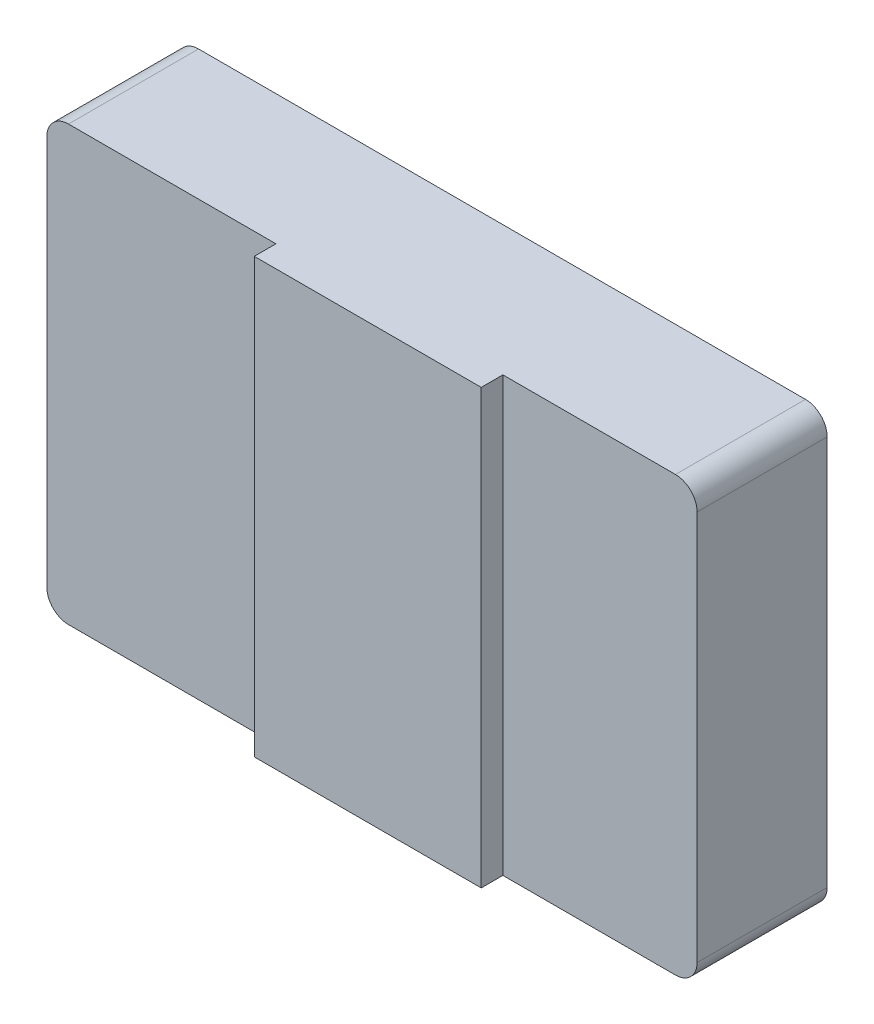
ISO-10303-21;
HEADER;
FILE_DESCRIPTION(('STEP AP214'),'2;1');
FILE_NAME('part.step','',(''),(''),'','','');
FILE_SCHEMA(('AUTOMOTIVE_DESIGN { 1 0 10303 214 1 1 1 1 }'));
ENDSEC;
DATA;
#1=APPLICATION_CONTEXT('core data for automotive mechanical design processes');
#2=APPLICATION_PROTOCOL_DEFINITION('international standard','automotive_design',2000,#1);
#3=PRODUCT_CONTEXT('',#1,'mechanical');
#4=PRODUCT('Part','Part','',(#3));
#5=PRODUCT_RELATED_PRODUCT_CATEGORY('part','',(#4));
#6=PRODUCT_DEFINITION_FORMATION('','',#4);
#7=PRODUCT_DEFINITION_CONTEXT('part definition',#1,'design');
#8=PRODUCT_DEFINITION('design','',#6,#7);
#9=PRODUCT_DEFINITION_SHAPE('','',#8);
#10=(LENGTH_UNIT() NAMED_UNIT(*) SI_UNIT(.MILLI.,.METRE.));
#11=(NAMED_UNIT(*) PLANE_ANGLE_UNIT() SI_UNIT($,.RADIAN.));
#12=(NAMED_UNIT(*) SI_UNIT($,.STERADIAN.) SOLID_ANGLE_UNIT());
#13=UNCERTAINTY_MEASURE_WITH_UNIT(LENGTH_MEASURE(1.E-05),#10,'distance_accuracy_value','');
#14=(GEOMETRIC_REPRESENTATION_CONTEXT(3) GLOBAL_UNCERTAINTY_ASSIGNED_CONTEXT((#13)) GLOBAL_UNIT_ASSIGNED_CONTEXT((#10,
#11,#12)) REPRESENTATION_CONTEXT('',''));
#15=CARTESIAN_POINT('',(0.,0.,0.));
#16=DIRECTION('',(0.,0.,1.));
#17=DIRECTION('',(1.,0.,0.));
#18=AXIS2_PLACEMENT_3D('',#15,#16,#17);
#19=CARTESIAN_POINT('',(0.,0.,0.7));
#20=DIRECTION('',(1.,0.,0.));
#21=DIRECTION('',(0.,0.,-1.));
#22=AXIS2_PLACEMENT_3D('',#19,#20,#21);
#23=PLANE('',#22);
#24=DIRECTION('',(0.,-1.,0.));
#25=VECTOR('',#24,1.);
#26=CARTESIAN_POINT('',(0.,0.,0.));
#27=LINE('',#26,#25);
#28=CARTESIAN_POINT('',(0.,1.9,0.));
#29=VERTEX_POINT('',#28);
#30=CARTESIAN_POINT('',(0.,0.1,0.));
#31=VERTEX_POINT('',#30);
#32=EDGE_CURVE('E169',#29,#31,#27,.T.);
#33=ORIENTED_EDGE('',*,*,#32,.T.);
#34=DIRECTION('',(0.,0.,-1.));
#35=VECTOR('',#34,1.);
#36=CARTESIAN_POINT('',(0.,0.1,0.7));
#37=LINE('',#36,#35);
#38=CARTESIAN_POINT('',(0.,0.1,0.6));
#39=VERTEX_POINT('',#38);
#40=EDGE_CURVE('E50',#31,#39,#37,.F.);
#41=ORIENTED_EDGE('',*,*,#40,.T.);
#42=DIRECTION('',(0.,-1.,0.));
#43=VECTOR('',#42,1.);
#44=CARTESIAN_POINT('',(0.,0.,0.6));
#45=LINE('',#44,#43);
#46=CARTESIAN_POINT('',(0.,1.9,0.6));
#47=VERTEX_POINT('',#46);
#48=EDGE_CURVE('E134',#47,#39,#45,.T.);
#49=ORIENTED_EDGE('',*,*,#48,.F.);
#50=DIRECTION('',(0.,0.,-1.));
#51=VECTOR('',#50,1.);
#52=CARTESIAN_POINT('',(0.,1.9,0.7));
#53=LINE('',#52,#51);
#54=EDGE_CURVE('E206',#47,#29,#53,.T.);
#55=ORIENTED_EDGE('',*,*,#54,.T.);
#56=EDGE_LOOP('',(#33,#41,#49,#55));
#57=FACE_BOUND('',#56,.T.);
#58=ADVANCED_FACE('F35',(#57),#23,.F.);
#59=CARTESIAN_POINT('',(0.,0.,0.7));
#60=DIRECTION('',(0.,1.,0.));
#61=DIRECTION('',(0.,0.,1.));
#62=AXIS2_PLACEMENT_3D('',#59,#60,#61);
#63=PLANE('',#62);
#64=DIRECTION('',(1.,0.,0.));
#65=VECTOR('',#64,1.);
#66=CARTESIAN_POINT('',(0.,0.,0.));
#67=LINE('',#66,#65);
#68=CARTESIAN_POINT('',(0.1,0.,0.));
#69=VERTEX_POINT('',#68);
#70=CARTESIAN_POINT('',(2.9,0.,0.));
#71=VERTEX_POINT('',#70);
#72=EDGE_CURVE('E171',#69,#71,#67,.T.);
#73=ORIENTED_EDGE('',*,*,#72,.T.);
#74=DIRECTION('',(0.,0.,-1.));
#75=VECTOR('',#74,1.);
#76=CARTESIAN_POINT('',(2.9,0.,0.7));
#77=LINE('',#76,#75);
#78=CARTESIAN_POINT('',(2.9,0.,0.6));
#79=VERTEX_POINT('',#78);
#80=EDGE_CURVE('E204',#71,#79,#77,.F.);
#81=ORIENTED_EDGE('',*,*,#80,.T.);
#82=DIRECTION('',(1.,0.,0.));
#83=VECTOR('',#82,1.);
#84=CARTESIAN_POINT('',(0.,0.,0.6));
#85=LINE('',#84,#83);
#86=CARTESIAN_POINT('',(2.10400262426842,0.,0.6));
#87=VERTEX_POINT('',#86);
#88=EDGE_CURVE('E136',#87,#79,#85,.T.);
#89=ORIENTED_EDGE('',*,*,#88,.F.);
#90=DIRECTION('',(0.,0.,1.));
#91=VECTOR('',#90,1.);
#92=CARTESIAN_POINT('',(2.10400262426842,0.,0.6));
#93=LINE('',#92,#91);
#94=CARTESIAN_POINT('',(2.10400262426842,0.,0.7));
#95=VERTEX_POINT('',#94);
#96=EDGE_CURVE('E152',#87,#95,#93,.T.);
#97=ORIENTED_EDGE('',*,*,#96,.T.);
#98=DIRECTION('',(1.,0.,0.));
#99=VECTOR('',#98,1.);
#100=CARTESIAN_POINT('',(0.,0.,0.7));
#101=LINE('',#100,#99);
#102=CARTESIAN_POINT('',(1.0569541190119,0.,0.7));
#103=VERTEX_POINT('',#102);
#104=EDGE_CURVE('E151',#103,#95,#101,.T.);
#105=ORIENTED_EDGE('',*,*,#104,.F.);
#106=DIRECTION('',(0.,0.,1.));
#107=VECTOR('',#106,1.);
#108=CARTESIAN_POINT('',(1.0569541190119,0.,0.6));
#109=LINE('',#108,#107);
#110=CARTESIAN_POINT('',(1.0569541190119,0.,0.6));
#111=VERTEX_POINT('',#110);
#112=EDGE_CURVE('E139',#111,#103,#109,.T.);
#113=ORIENTED_EDGE('',*,*,#112,.F.);
#114=CARTESIAN_POINT('',(0.1,0.,0.6));
#115=VERTEX_POINT('',#114);
#116=EDGE_CURVE('E123',#115,#111,#85,.T.);
#117=ORIENTED_EDGE('',*,*,#116,.F.);
#118=DIRECTION('',(0.,0.,-1.));
#119=VECTOR('',#118,1.);
#120=CARTESIAN_POINT('',(0.1,0.,0.7));
#121=LINE('',#120,#119);
#122=EDGE_CURVE('E202',#115,#69,#121,.T.);
#123=ORIENTED_EDGE('',*,*,#122,.T.);
#124=EDGE_LOOP('',(#73,#81,#89,#97,#105,#113,#117,#123));
#125=FACE_BOUND('',#124,.T.);
#126=ADVANCED_FACE('F148',(#125),#63,.F.);
#127=CARTESIAN_POINT('',(3.,0.,0.7));
#128=DIRECTION('',(-1.,0.,0.));
#129=DIRECTION('',(0.,0.,1.));
#130=AXIS2_PLACEMENT_3D('',#127,#128,#129);
#131=PLANE('',#130);
#132=DIRECTION('',(0.,1.,0.));
#133=VECTOR('',#132,1.);
#134=CARTESIAN_POINT('',(3.,0.,0.));
#135=LINE('',#134,#133);
#136=CARTESIAN_POINT('',(3.,0.1,0.));
#137=VERTEX_POINT('',#136);
#138=CARTESIAN_POINT('',(3.,1.9,0.));
#139=VERTEX_POINT('',#138);
#140=EDGE_CURVE('E173',#137,#139,#135,.T.);
#141=ORIENTED_EDGE('',*,*,#140,.T.);
#142=DIRECTION('',(0.,0.,-1.));
#143=VECTOR('',#142,1.);
#144=CARTESIAN_POINT('',(3.,1.9,0.7));
#145=LINE('',#144,#143);
#146=CARTESIAN_POINT('',(3.,1.9,0.6));
#147=VERTEX_POINT('',#146);
#148=EDGE_CURVE('E196',#139,#147,#145,.F.);
#149=ORIENTED_EDGE('',*,*,#148,.T.);
#150=DIRECTION('',(0.,1.,0.));
#151=VECTOR('',#150,1.);
#152=CARTESIAN_POINT('',(3.,0.,0.6));
#153=LINE('',#152,#151);
#154=CARTESIAN_POINT('',(3.,0.1,0.6));
#155=VERTEX_POINT('',#154);
#156=EDGE_CURVE('E133',#155,#147,#153,.T.);
#157=ORIENTED_EDGE('',*,*,#156,.F.);
#158=DIRECTION('',(0.,0.,-1.));
#159=VECTOR('',#158,1.);
#160=CARTESIAN_POINT('',(3.,0.1,0.7));
#161=LINE('',#160,#159);
#162=EDGE_CURVE('E193',#155,#137,#161,.T.);
#163=ORIENTED_EDGE('',*,*,#162,.T.);
#164=EDGE_LOOP('',(#141,#149,#157,#163));
#165=FACE_BOUND('',#164,.T.);
#166=ADVANCED_FACE('F230',(#165),#131,.F.);
#167=CARTESIAN_POINT('',(0.,2.,0.7));
#168=DIRECTION('',(0.,-1.,0.));
#169=DIRECTION('',(0.,0.,-1.));
#170=AXIS2_PLACEMENT_3D('',#167,#168,#169);
#171=PLANE('',#170);
#172=DIRECTION('',(-1.,0.,0.));
#173=VECTOR('',#172,1.);
#174=CARTESIAN_POINT('',(0.,2.,0.6));
#175=LINE('',#174,#173);
#176=CARTESIAN_POINT('',(2.9,2.,0.6));
#177=VERTEX_POINT('',#176);
#178=CARTESIAN_POINT('',(2.10400262426842,2.,0.6));
#179=VERTEX_POINT('',#178);
#180=EDGE_CURVE('E178',#177,#179,#175,.T.);
#181=ORIENTED_EDGE('',*,*,#180,.F.);
#182=DIRECTION('',(0.,0.,-1.));
#183=VECTOR('',#182,1.);
#184=CARTESIAN_POINT('',(2.9,2.,0.7));
#185=LINE('',#184,#183);
#186=CARTESIAN_POINT('',(2.9,2.,0.));
#187=VERTEX_POINT('',#186);
#188=EDGE_CURVE('E182',#177,#187,#185,.T.);
#189=ORIENTED_EDGE('',*,*,#188,.T.);
#190=DIRECTION('',(-1.,0.,0.));
#191=VECTOR('',#190,1.);
#192=CARTESIAN_POINT('',(0.,2.,0.));
#193=LINE('',#192,#191);
#194=CARTESIAN_POINT('',(0.1,2.,0.));
#195=VERTEX_POINT('',#194);
#196=EDGE_CURVE('E165',#187,#195,#193,.T.);
#197=ORIENTED_EDGE('',*,*,#196,.T.);
#198=DIRECTION('',(0.,0.,-1.));
#199=VECTOR('',#198,1.);
#200=CARTESIAN_POINT('',(0.1,2.,0.7));
#201=LINE('',#200,#199);
#202=CARTESIAN_POINT('',(0.1,2.,0.6));
#203=VERTEX_POINT('',#202);
#204=EDGE_CURVE('E180',#195,#203,#201,.F.);
#205=ORIENTED_EDGE('',*,*,#204,.T.);
#206=CARTESIAN_POINT('',(1.0569541190119,2.,0.6));
#207=VERTEX_POINT('',#206);
#208=EDGE_CURVE('E168',#207,#203,#175,.T.);
#209=ORIENTED_EDGE('',*,*,#208,.F.);
#210=DIRECTION('',(0.,0.,1.));
#211=VECTOR('',#210,1.);
#212=CARTESIAN_POINT('',(1.0569541190119,2.,0.6));
#213=LINE('',#212,#211);
#214=CARTESIAN_POINT('',(1.0569541190119,2.,0.7));
#215=VERTEX_POINT('',#214);
#216=EDGE_CURVE('E142',#207,#215,#213,.T.);
#217=ORIENTED_EDGE('',*,*,#216,.T.);
#218=DIRECTION('',(-1.,0.,0.));
#219=VECTOR('',#218,1.);
#220=CARTESIAN_POINT('',(0.,2.,0.7));
#221=LINE('',#220,#219);
#222=CARTESIAN_POINT('',(2.10400262426842,2.,0.7));
#223=VERTEX_POINT('',#222);
#224=EDGE_CURVE('E164',#223,#215,#221,.T.);
#225=ORIENTED_EDGE('',*,*,#224,.F.);
#226=DIRECTION('',(0.,0.,1.));
#227=VECTOR('',#226,1.);
#228=CARTESIAN_POINT('',(2.10400262426842,2.,0.6));
#229=LINE('',#228,#227);
#230=EDGE_CURVE('E154',#179,#223,#229,.T.);
#231=ORIENTED_EDGE('',*,*,#230,.F.);
#232=EDGE_LOOP('',(#181,#189,#197,#205,#209,#217,#225,#231));
#233=FACE_BOUND('',#232,.T.);
#234=ADVANCED_FACE('F239',(#233),#171,.F.);
#235=CARTESIAN_POINT('',(0.,0.,0.7));
#236=DIRECTION('',(0.,0.,-1.));
#237=DIRECTION('',(-1.,0.,0.));
#238=AXIS2_PLACEMENT_3D('',#235,#236,#237);
#239=PLANE('',#238);
#240=DIRECTION('',(0.,-1.,0.));
#241=VECTOR('',#240,1.);
#242=CARTESIAN_POINT('',(1.0569541190119,2.,0.7));
#243=LINE('',#242,#241);
#244=EDGE_CURVE('E246',#215,#103,#243,.T.);
#245=ORIENTED_EDGE('',*,*,#244,.T.);
#246=ORIENTED_EDGE('',*,*,#104,.T.);
#247=DIRECTION('',(0.,1.,0.));
#248=VECTOR('',#247,1.);
#249=CARTESIAN_POINT('',(2.10400262426842,2.,0.7));
#250=LINE('',#249,#248);
#251=EDGE_CURVE('E144',#95,#223,#250,.T.);
#252=ORIENTED_EDGE('',*,*,#251,.T.);
#253=ORIENTED_EDGE('',*,*,#224,.T.);
#254=EDGE_LOOP('',(#245,#246,#252,#253));
#255=FACE_BOUND('',#254,.T.);
#256=ADVANCED_FACE('F248',(#255),#239,.F.);
#257=CARTESIAN_POINT('',(0.,0.,0.));
#258=DIRECTION('',(0.,0.,-1.));
#259=DIRECTION('',(-1.,0.,0.));
#260=AXIS2_PLACEMENT_3D('',#257,#258,#259);
#261=PLANE('',#260);
#262=ORIENTED_EDGE('',*,*,#196,.F.);
#263=CARTESIAN_POINT('',(2.9,1.9,0.));
#264=DIRECTION('',(0.,0.,-1.));
#265=DIRECTION('',(-1.,0.,0.));
#266=AXIS2_PLACEMENT_3D('',#263,#264,#265);
#267=CIRCLE('',#266,0.1);
#268=EDGE_CURVE('E191',#187,#139,#267,.T.);
#269=ORIENTED_EDGE('',*,*,#268,.T.);
#270=ORIENTED_EDGE('',*,*,#140,.F.);
#271=CARTESIAN_POINT('',(2.9,0.1,0.));
#272=DIRECTION('',(0.,0.,-1.));
#273=DIRECTION('',(-1.,0.,0.));
#274=AXIS2_PLACEMENT_3D('',#271,#272,#273);
#275=CIRCLE('',#274,0.1);
#276=EDGE_CURVE('E189',#137,#71,#275,.T.);
#277=ORIENTED_EDGE('',*,*,#276,.T.);
#278=ORIENTED_EDGE('',*,*,#72,.F.);
#279=CARTESIAN_POINT('',(0.1,0.1,0.));
#280=DIRECTION('',(0.,0.,-1.));
#281=DIRECTION('',(-1.,0.,0.));
#282=AXIS2_PLACEMENT_3D('',#279,#280,#281);
#283=CIRCLE('',#282,0.1);
#284=EDGE_CURVE('E187',#69,#31,#283,.T.);
#285=ORIENTED_EDGE('',*,*,#284,.T.);
#286=ORIENTED_EDGE('',*,*,#32,.F.);
#287=CARTESIAN_POINT('',(0.1,1.9,0.));
#288=DIRECTION('',(0.,0.,-1.));
#289=DIRECTION('',(-1.,0.,0.));
#290=AXIS2_PLACEMENT_3D('',#287,#288,#289);
#291=CIRCLE('',#290,0.1);
#292=EDGE_CURVE('E185',#29,#195,#291,.T.);
#293=ORIENTED_EDGE('',*,*,#292,.T.);
#294=EDGE_LOOP('',(#262,#269,#270,#277,#278,#285,#286,#293));
#295=FACE_BOUND('',#294,.T.);
#296=ADVANCED_FACE('F214',(#295),#261,.T.);
#297=CARTESIAN_POINT('',(2.10400262426842,2.,0.6));
#298=DIRECTION('',(1.,0.,0.));
#299=DIRECTION('',(0.,0.,-1.));
#300=AXIS2_PLACEMENT_3D('',#297,#298,#299);
#301=PLANE('',#300);
#302=ORIENTED_EDGE('',*,*,#251,.F.);
#303=ORIENTED_EDGE('',*,*,#96,.F.);
#304=DIRECTION('',(0.,1.,0.));
#305=VECTOR('',#304,1.);
#306=CARTESIAN_POINT('',(2.10400262426842,2.,0.6));
#307=LINE('',#306,#305);
#308=EDGE_CURVE('E143',#87,#179,#307,.T.);
#309=ORIENTED_EDGE('',*,*,#308,.T.);
#310=ORIENTED_EDGE('',*,*,#230,.T.);
#311=EDGE_LOOP('',(#302,#303,#309,#310));
#312=FACE_BOUND('',#311,.T.);
#313=ADVANCED_FACE('F308',(#312),#301,.T.);
#314=CARTESIAN_POINT('',(1.5,1.,0.6));
#315=DIRECTION('',(0.,0.,1.));
#316=DIRECTION('',(1.,0.,0.));
#317=AXIS2_PLACEMENT_3D('',#314,#315,#316);
#318=PLANE('',#317);
#319=ORIENTED_EDGE('',*,*,#156,.T.);
#320=CARTESIAN_POINT('',(2.9,1.9,0.6));
#321=DIRECTION('',(0.,0.,1.));
#322=DIRECTION('',(1.,0.,0.));
#323=AXIS2_PLACEMENT_3D('',#320,#321,#322);
#324=CIRCLE('',#323,0.1);
#325=EDGE_CURVE('E200',#147,#177,#324,.T.);
#326=ORIENTED_EDGE('',*,*,#325,.T.);
#327=ORIENTED_EDGE('',*,*,#180,.T.);
#328=ORIENTED_EDGE('',*,*,#308,.F.);
#329=ORIENTED_EDGE('',*,*,#88,.T.);
#330=CARTESIAN_POINT('',(2.9,0.1,0.6));
#331=DIRECTION('',(0.,0.,1.));
#332=DIRECTION('',(1.,0.,0.));
#333=AXIS2_PLACEMENT_3D('',#330,#331,#332);
#334=CIRCLE('',#333,0.1);
#335=EDGE_CURVE('E198',#79,#155,#334,.T.);
#336=ORIENTED_EDGE('',*,*,#335,.T.);
#337=EDGE_LOOP('',(#319,#326,#327,#328,#329,#336));
#338=FACE_BOUND('',#337,.T.);
#339=ADVANCED_FACE('F227',(#338),#318,.T.);
#340=ORIENTED_EDGE('',*,*,#48,.T.);
#341=CARTESIAN_POINT('',(0.1,0.1,0.6));
#342=DIRECTION('',(0.,0.,1.));
#343=DIRECTION('',(1.,0.,0.));
#344=AXIS2_PLACEMENT_3D('',#341,#342,#343);
#345=CIRCLE('',#344,0.1);
#346=EDGE_CURVE('E12',#39,#115,#345,.T.);
#347=ORIENTED_EDGE('',*,*,#346,.T.);
#348=ORIENTED_EDGE('',*,*,#116,.T.);
#349=DIRECTION('',(0.,-1.,0.));
#350=VECTOR('',#349,1.);
#351=CARTESIAN_POINT('',(1.0569541190119,2.,0.6));
#352=LINE('',#351,#350);
#353=EDGE_CURVE('E126',#207,#111,#352,.T.);
#354=ORIENTED_EDGE('',*,*,#353,.F.);
#355=ORIENTED_EDGE('',*,*,#208,.T.);
#356=CARTESIAN_POINT('',(0.1,1.9,0.6));
#357=DIRECTION('',(0.,0.,1.));
#358=DIRECTION('',(1.,0.,0.));
#359=AXIS2_PLACEMENT_3D('',#356,#357,#358);
#360=CIRCLE('',#359,0.1);
#361=EDGE_CURVE('E43',#203,#47,#360,.T.);
#362=ORIENTED_EDGE('',*,*,#361,.T.);
#363=EDGE_LOOP('',(#340,#347,#348,#354,#355,#362));
#364=FACE_BOUND('',#363,.T.);
#365=ADVANCED_FACE('F125',(#364),#318,.T.);
#366=CARTESIAN_POINT('',(1.0569541190119,2.,0.6));
#367=DIRECTION('',(-1.,0.,0.));
#368=DIRECTION('',(0.,0.,1.));
#369=AXIS2_PLACEMENT_3D('',#366,#367,#368);
#370=PLANE('',#369);
#371=ORIENTED_EDGE('',*,*,#244,.F.);
#372=ORIENTED_EDGE('',*,*,#216,.F.);
#373=ORIENTED_EDGE('',*,*,#353,.T.);
#374=ORIENTED_EDGE('',*,*,#112,.T.);
#375=EDGE_LOOP('',(#371,#372,#373,#374));
#376=FACE_BOUND('',#375,.T.);
#377=ADVANCED_FACE('F138',(#376),#370,.T.);
#378=CARTESIAN_POINT('',(2.9,1.9,0.7));
#379=DIRECTION('',(0.,0.,-1.));
#380=DIRECTION('',(-1.,0.,0.));
#381=AXIS2_PLACEMENT_3D('',#378,#379,#380);
#382=CYLINDRICAL_SURFACE('',#381,0.1);
#383=ORIENTED_EDGE('',*,*,#325,.F.);
#384=ORIENTED_EDGE('',*,*,#148,.F.);
#385=ORIENTED_EDGE('',*,*,#268,.F.);
#386=ORIENTED_EDGE('',*,*,#188,.F.);
#387=EDGE_LOOP('',(#383,#384,#385,#386));
#388=FACE_BOUND('',#387,.T.);
#389=ADVANCED_FACE('F234',(#388),#382,.T.);
#390=CARTESIAN_POINT('',(2.9,0.1,0.7));
#391=DIRECTION('',(0.,0.,-1.));
#392=DIRECTION('',(-1.,0.,0.));
#393=AXIS2_PLACEMENT_3D('',#390,#391,#392);
#394=CYLINDRICAL_SURFACE('',#393,0.1);
#395=ORIENTED_EDGE('',*,*,#335,.F.);
#396=ORIENTED_EDGE('',*,*,#80,.F.);
#397=ORIENTED_EDGE('',*,*,#276,.F.);
#398=ORIENTED_EDGE('',*,*,#162,.F.);
#399=EDGE_LOOP('',(#395,#396,#397,#398));
#400=FACE_BOUND('',#399,.T.);
#401=ADVANCED_FACE('F223',(#400),#394,.T.);
#402=CARTESIAN_POINT('',(0.1,0.1,0.7));
#403=DIRECTION('',(0.,0.,-1.));
#404=DIRECTION('',(-1.,0.,0.));
#405=AXIS2_PLACEMENT_3D('',#402,#403,#404);
#406=CYLINDRICAL_SURFACE('',#405,0.1);
#407=ORIENTED_EDGE('',*,*,#346,.F.);
#408=ORIENTED_EDGE('',*,*,#40,.F.);
#409=ORIENTED_EDGE('',*,*,#284,.F.);
#410=ORIENTED_EDGE('',*,*,#122,.F.);
#411=EDGE_LOOP('',(#407,#408,#409,#410));
#412=FACE_BOUND('',#411,.T.);
#413=ADVANCED_FACE('F217',(#412),#406,.T.);
#414=CARTESIAN_POINT('',(0.1,1.9,0.7));
#415=DIRECTION('',(0.,0.,-1.));
#416=DIRECTION('',(-1.,0.,0.));
#417=AXIS2_PLACEMENT_3D('',#414,#415,#416);
#418=CYLINDRICAL_SURFACE('',#417,0.1);
#419=ORIENTED_EDGE('',*,*,#361,.F.);
#420=ORIENTED_EDGE('',*,*,#204,.F.);
#421=ORIENTED_EDGE('',*,*,#292,.F.);
#422=ORIENTED_EDGE('',*,*,#54,.F.);
#423=EDGE_LOOP('',(#419,#420,#421,#422));
#424=FACE_BOUND('',#423,.T.);
#425=ADVANCED_FACE('F37',(#424),#418,.T.);
#426=CLOSED_SHELL('',(#58,#126,#166,#234,#256,#296,#313,#339,#365,#377,#389,#401,#413,#425));
#427=MANIFOLD_SOLID_BREP('B2',#426);
#428=ADVANCED_BREP_SHAPE_REPRESENTATION('',(#18,#427),#14);
#429=SHAPE_DEFINITION_REPRESENTATION(#9,#428);
ENDSEC;
END-ISO-10303-21;
